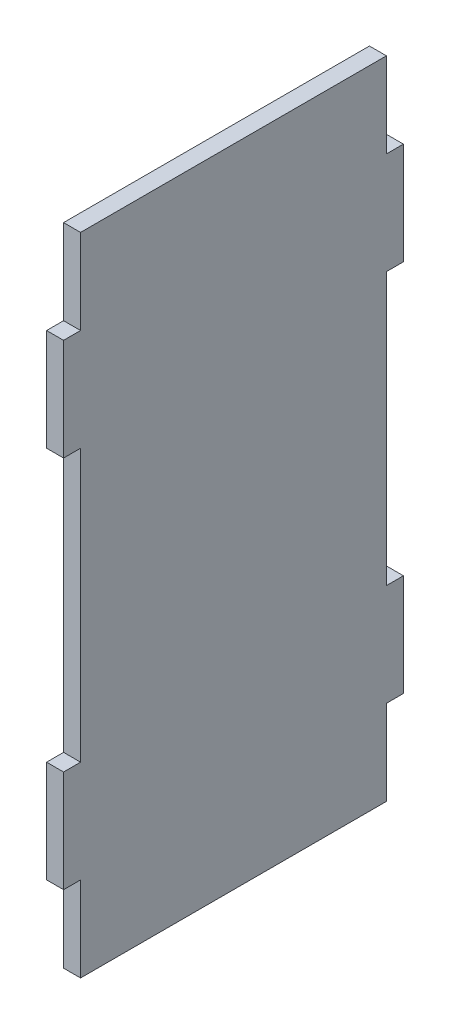
ISO-10303-21;
HEADER;
FILE_DESCRIPTION(('STEP AP214'),'2;1');
FILE_NAME('part.step','',(''),(''),'','','');
FILE_SCHEMA(('AUTOMOTIVE_DESIGN { 1 0 10303 214 1 1 1 1 }'));
ENDSEC;
DATA;
#1=APPLICATION_CONTEXT('core data for automotive mechanical design processes');
#2=APPLICATION_PROTOCOL_DEFINITION('international standard','automotive_design',2000,#1);
#3=PRODUCT_CONTEXT('',#1,'mechanical');
#4=PRODUCT('Part','Part','',(#3));
#5=PRODUCT_RELATED_PRODUCT_CATEGORY('part','',(#4));
#6=PRODUCT_DEFINITION_FORMATION('','',#4);
#7=PRODUCT_DEFINITION_CONTEXT('part definition',#1,'design');
#8=PRODUCT_DEFINITION('design','',#6,#7);
#9=PRODUCT_DEFINITION_SHAPE('','',#8);
#10=(LENGTH_UNIT() NAMED_UNIT(*) SI_UNIT(.MILLI.,.METRE.));
#11=(NAMED_UNIT(*) PLANE_ANGLE_UNIT() SI_UNIT($,.RADIAN.));
#12=(NAMED_UNIT(*) SI_UNIT($,.STERADIAN.) SOLID_ANGLE_UNIT());
#13=UNCERTAINTY_MEASURE_WITH_UNIT(LENGTH_MEASURE(1.E-05),#10,'distance_accuracy_value','');
#14=(GEOMETRIC_REPRESENTATION_CONTEXT(3) GLOBAL_UNCERTAINTY_ASSIGNED_CONTEXT((#13)) GLOBAL_UNIT_ASSIGNED_CONTEXT((#10,
#11,#12)) REPRESENTATION_CONTEXT('',''));
#15=CARTESIAN_POINT('',(0.,0.,0.));
#16=DIRECTION('',(0.,0.,1.));
#17=DIRECTION('',(1.,0.,0.));
#18=AXIS2_PLACEMENT_3D('',#15,#16,#17);
#19=CARTESIAN_POINT('',(3.175,0.,0.));
#20=DIRECTION('',(0.,0.,-1.));
#21=DIRECTION('',(-1.,0.,0.));
#22=AXIS2_PLACEMENT_3D('',#19,#20,#21);
#23=PLANE('',#22);
#24=DIRECTION('',(0.,-1.,0.));
#25=VECTOR('',#24,1.);
#26=CARTESIAN_POINT('',(0.,0.,0.));
#27=LINE('',#26,#25);
#28=CARTESIAN_POINT('',(0.,15.875,0.));
#29=VERTEX_POINT('',#28);
#30=CARTESIAN_POINT('',(0.,0.,0.));
#31=VERTEX_POINT('',#30);
#32=EDGE_CURVE('E201',#29,#31,#27,.T.);
#33=ORIENTED_EDGE('',*,*,#32,.T.);
#34=DIRECTION('',(-1.,0.,0.));
#35=VECTOR('',#34,1.);
#36=CARTESIAN_POINT('',(3.175,0.,0.));
#37=LINE('',#36,#35);
#38=CARTESIAN_POINT('',(3.175,0.,0.));
#39=VERTEX_POINT('',#38);
#40=EDGE_CURVE('E11',#39,#31,#37,.T.);
#41=ORIENTED_EDGE('',*,*,#40,.F.);
#42=DIRECTION('',(0.,-1.,0.));
#43=VECTOR('',#42,1.);
#44=CARTESIAN_POINT('',(3.175,0.,0.));
#45=LINE('',#44,#43);
#46=CARTESIAN_POINT('',(3.175,15.875,0.));
#47=VERTEX_POINT('',#46);
#48=EDGE_CURVE('E239',#47,#39,#45,.T.);
#49=ORIENTED_EDGE('',*,*,#48,.F.);
#50=DIRECTION('',(-1.,0.,0.));
#51=VECTOR('',#50,1.);
#52=CARTESIAN_POINT('',(3.175,15.875,0.));
#53=LINE('',#52,#51);
#54=EDGE_CURVE('E197',#47,#29,#53,.T.);
#55=ORIENTED_EDGE('',*,*,#54,.T.);
#56=EDGE_LOOP('',(#33,#41,#49,#55));
#57=FACE_BOUND('',#56,.T.);
#58=ADVANCED_FACE('F33',(#57),#23,.F.);
#59=CARTESIAN_POINT('',(3.175,0.,0.));
#60=DIRECTION('',(0.,1.,0.));
#61=DIRECTION('',(0.,0.,1.));
#62=AXIS2_PLACEMENT_3D('',#59,#60,#61);
#63=PLANE('',#62);
#64=DIRECTION('',(0.,0.,-1.));
#65=VECTOR('',#64,1.);
#66=CARTESIAN_POINT('',(0.,0.,0.));
#67=LINE('',#66,#65);
#68=CARTESIAN_POINT('',(0.,0.,-57.15));
#69=VERTEX_POINT('',#68);
#70=EDGE_CURVE('E204',#31,#69,#67,.T.);
#71=ORIENTED_EDGE('',*,*,#70,.T.);
#72=DIRECTION('',(-1.,0.,0.));
#73=VECTOR('',#72,1.);
#74=CARTESIAN_POINT('',(3.175,0.,-57.15));
#75=LINE('',#74,#73);
#76=CARTESIAN_POINT('',(3.175,0.,-57.15));
#77=VERTEX_POINT('',#76);
#78=EDGE_CURVE('E41',#77,#69,#75,.T.);
#79=ORIENTED_EDGE('',*,*,#78,.F.);
#80=DIRECTION('',(0.,0.,-1.));
#81=VECTOR('',#80,1.);
#82=CARTESIAN_POINT('',(3.175,0.,0.));
#83=LINE('',#82,#81);
#84=EDGE_CURVE('E128',#39,#77,#83,.T.);
#85=ORIENTED_EDGE('',*,*,#84,.F.);
#86=ORIENTED_EDGE('',*,*,#40,.T.);
#87=EDGE_LOOP('',(#71,#79,#85,#86));
#88=FACE_BOUND('',#87,.T.);
#89=ADVANCED_FACE('F357',(#88),#63,.F.);
#90=CARTESIAN_POINT('',(3.175,0.,-57.15));
#91=DIRECTION('',(0.,0.,1.));
#92=DIRECTION('',(1.,0.,0.));
#93=AXIS2_PLACEMENT_3D('',#90,#91,#92);
#94=PLANE('',#93);
#95=DIRECTION('',(0.,1.,0.));
#96=VECTOR('',#95,1.);
#97=CARTESIAN_POINT('',(0.,0.,-57.15));
#98=LINE('',#97,#96);
#99=CARTESIAN_POINT('',(0.,15.875,-57.15));
#100=VERTEX_POINT('',#99);
#101=EDGE_CURVE('E206',#69,#100,#98,.T.);
#102=ORIENTED_EDGE('',*,*,#101,.T.);
#103=DIRECTION('',(-1.,0.,0.));
#104=VECTOR('',#103,1.);
#105=CARTESIAN_POINT('',(3.175,15.875,-57.15));
#106=LINE('',#105,#104);
#107=CARTESIAN_POINT('',(3.175,15.875,-57.15));
#108=VERTEX_POINT('',#107);
#109=EDGE_CURVE('E282',#108,#100,#106,.T.);
#110=ORIENTED_EDGE('',*,*,#109,.F.);
#111=DIRECTION('',(0.,1.,0.));
#112=VECTOR('',#111,1.);
#113=CARTESIAN_POINT('',(3.175,0.,-57.15));
#114=LINE('',#113,#112);
#115=EDGE_CURVE('E290',#77,#108,#114,.T.);
#116=ORIENTED_EDGE('',*,*,#115,.F.);
#117=ORIENTED_EDGE('',*,*,#78,.T.);
#118=EDGE_LOOP('',(#102,#110,#116,#117));
#119=FACE_BOUND('',#118,.T.);
#120=ADVANCED_FACE('F288',(#119),#94,.F.);
#121=CARTESIAN_POINT('',(3.175,15.875,-57.15));
#122=DIRECTION('',(0.,1.,0.));
#123=DIRECTION('',(0.,0.,1.));
#124=AXIS2_PLACEMENT_3D('',#121,#122,#123);
#125=PLANE('',#124);
#126=DIRECTION('',(0.,0.,-1.));
#127=VECTOR('',#126,1.);
#128=CARTESIAN_POINT('',(0.,15.875,-57.15));
#129=LINE('',#128,#127);
#130=CARTESIAN_POINT('',(0.,15.875,-60.325));
#131=VERTEX_POINT('',#130);
#132=EDGE_CURVE('E208',#100,#131,#129,.T.);
#133=ORIENTED_EDGE('',*,*,#132,.T.);
#134=DIRECTION('',(-1.,0.,0.));
#135=VECTOR('',#134,1.);
#136=CARTESIAN_POINT('',(3.175,15.875,-60.325));
#137=LINE('',#136,#135);
#138=CARTESIAN_POINT('',(3.175,15.875,-60.325));
#139=VERTEX_POINT('',#138);
#140=EDGE_CURVE('E279',#139,#131,#137,.T.);
#141=ORIENTED_EDGE('',*,*,#140,.F.);
#142=DIRECTION('',(0.,0.,-1.));
#143=VECTOR('',#142,1.);
#144=CARTESIAN_POINT('',(3.175,15.875,-57.15));
#145=LINE('',#144,#143);
#146=EDGE_CURVE('E308',#108,#139,#145,.T.);
#147=ORIENTED_EDGE('',*,*,#146,.F.);
#148=ORIENTED_EDGE('',*,*,#109,.T.);
#149=EDGE_LOOP('',(#133,#141,#147,#148));
#150=FACE_BOUND('',#149,.T.);
#151=ADVANCED_FACE('F299',(#150),#125,.F.);
#152=CARTESIAN_POINT('',(3.175,15.875,-60.325));
#153=DIRECTION('',(0.,0.,1.));
#154=DIRECTION('',(0.,-1.,0.));
#155=AXIS2_PLACEMENT_3D('',#152,#153,#154);
#156=PLANE('',#155);
#157=DIRECTION('',(0.,1.,0.));
#158=VECTOR('',#157,1.);
#159=CARTESIAN_POINT('',(0.,15.875,-60.325));
#160=LINE('',#159,#158);
#161=CARTESIAN_POINT('',(0.,34.925,-60.325));
#162=VERTEX_POINT('',#161);
#163=EDGE_CURVE('E210',#131,#162,#160,.T.);
#164=ORIENTED_EDGE('',*,*,#163,.T.);
#165=DIRECTION('',(-1.,0.,0.));
#166=VECTOR('',#165,1.);
#167=CARTESIAN_POINT('',(3.175,34.925,-60.325));
#168=LINE('',#167,#166);
#169=CARTESIAN_POINT('',(3.175,34.925,-60.325));
#170=VERTEX_POINT('',#169);
#171=EDGE_CURVE('E276',#170,#162,#168,.T.);
#172=ORIENTED_EDGE('',*,*,#171,.F.);
#173=DIRECTION('',(0.,1.,0.));
#174=VECTOR('',#173,1.);
#175=CARTESIAN_POINT('',(3.175,15.875,-60.325));
#176=LINE('',#175,#174);
#177=EDGE_CURVE('E305',#139,#170,#176,.T.);
#178=ORIENTED_EDGE('',*,*,#177,.F.);
#179=ORIENTED_EDGE('',*,*,#140,.T.);
#180=EDGE_LOOP('',(#164,#172,#178,#179));
#181=FACE_BOUND('',#180,.T.);
#182=ADVANCED_FACE('F303',(#181),#156,.F.);
#183=CARTESIAN_POINT('',(3.175,34.925,-60.325));
#184=DIRECTION('',(0.,-1.,0.));
#185=DIRECTION('',(0.,0.,-1.));
#186=AXIS2_PLACEMENT_3D('',#183,#184,#185);
#187=PLANE('',#186);
#188=DIRECTION('',(0.,0.,1.));
#189=VECTOR('',#188,1.);
#190=CARTESIAN_POINT('',(0.,34.925,-60.325));
#191=LINE('',#190,#189);
#192=CARTESIAN_POINT('',(0.,34.925,-57.15));
#193=VERTEX_POINT('',#192);
#194=EDGE_CURVE('E212',#162,#193,#191,.T.);
#195=ORIENTED_EDGE('',*,*,#194,.T.);
#196=DIRECTION('',(-1.,0.,0.));
#197=VECTOR('',#196,1.);
#198=CARTESIAN_POINT('',(3.175,34.925,-57.15));
#199=LINE('',#198,#197);
#200=CARTESIAN_POINT('',(3.175,34.925,-57.15));
#201=VERTEX_POINT('',#200);
#202=EDGE_CURVE('E273',#201,#193,#199,.T.);
#203=ORIENTED_EDGE('',*,*,#202,.F.);
#204=DIRECTION('',(0.,0.,1.));
#205=VECTOR('',#204,1.);
#206=CARTESIAN_POINT('',(3.175,34.925,-60.325));
#207=LINE('',#206,#205);
#208=EDGE_CURVE('E307',#170,#201,#207,.T.);
#209=ORIENTED_EDGE('',*,*,#208,.F.);
#210=ORIENTED_EDGE('',*,*,#171,.T.);
#211=EDGE_LOOP('',(#195,#203,#209,#210));
#212=FACE_BOUND('',#211,.T.);
#213=ADVANCED_FACE('F370',(#212),#187,.F.);
#214=CARTESIAN_POINT('',(3.175,34.925,-57.15));
#215=DIRECTION('',(0.,0.,1.));
#216=DIRECTION('',(1.,0.,0.));
#217=AXIS2_PLACEMENT_3D('',#214,#215,#216);
#218=PLANE('',#217);
#219=DIRECTION('',(0.,1.,0.));
#220=VECTOR('',#219,1.);
#221=CARTESIAN_POINT('',(0.,34.925,-57.15));
#222=LINE('',#221,#220);
#223=CARTESIAN_POINT('',(0.,85.725,-57.15));
#224=VERTEX_POINT('',#223);
#225=EDGE_CURVE('E214',#193,#224,#222,.T.);
#226=ORIENTED_EDGE('',*,*,#225,.T.);
#227=DIRECTION('',(-1.,0.,0.));
#228=VECTOR('',#227,1.);
#229=CARTESIAN_POINT('',(3.175,85.725,-57.15));
#230=LINE('',#229,#228);
#231=CARTESIAN_POINT('',(3.175,85.725,-57.15));
#232=VERTEX_POINT('',#231);
#233=EDGE_CURVE('E270',#232,#224,#230,.T.);
#234=ORIENTED_EDGE('',*,*,#233,.F.);
#235=DIRECTION('',(0.,1.,0.));
#236=VECTOR('',#235,1.);
#237=CARTESIAN_POINT('',(3.175,34.925,-57.15));
#238=LINE('',#237,#236);
#239=EDGE_CURVE('E310',#201,#232,#238,.T.);
#240=ORIENTED_EDGE('',*,*,#239,.F.);
#241=ORIENTED_EDGE('',*,*,#202,.T.);
#242=EDGE_LOOP('',(#226,#234,#240,#241));
#243=FACE_BOUND('',#242,.T.);
#244=ADVANCED_FACE('F373',(#243),#218,.F.);
#245=CARTESIAN_POINT('',(3.175,85.725,-60.325));
#246=DIRECTION('',(0.,1.,0.));
#247=DIRECTION('',(0.,0.,1.));
#248=AXIS2_PLACEMENT_3D('',#245,#246,#247);
#249=PLANE('',#248);
#250=DIRECTION('',(0.,0.,-1.));
#251=VECTOR('',#250,1.);
#252=CARTESIAN_POINT('',(0.,85.725,-60.325));
#253=LINE('',#252,#251);
#254=CARTESIAN_POINT('',(0.,85.725,-60.325));
#255=VERTEX_POINT('',#254);
#256=EDGE_CURVE('E216',#224,#255,#253,.T.);
#257=ORIENTED_EDGE('',*,*,#256,.T.);
#258=DIRECTION('',(-1.,0.,0.));
#259=VECTOR('',#258,1.);
#260=CARTESIAN_POINT('',(3.175,85.725,-60.325));
#261=LINE('',#260,#259);
#262=CARTESIAN_POINT('',(3.175,85.725,-60.325));
#263=VERTEX_POINT('',#262);
#264=EDGE_CURVE('E267',#263,#255,#261,.T.);
#265=ORIENTED_EDGE('',*,*,#264,.F.);
#266=DIRECTION('',(0.,0.,-1.));
#267=VECTOR('',#266,1.);
#268=CARTESIAN_POINT('',(3.175,85.725,-60.325));
#269=LINE('',#268,#267);
#270=EDGE_CURVE('E316',#232,#263,#269,.T.);
#271=ORIENTED_EDGE('',*,*,#270,.F.);
#272=ORIENTED_EDGE('',*,*,#233,.T.);
#273=EDGE_LOOP('',(#257,#265,#271,#272));
#274=FACE_BOUND('',#273,.T.);
#275=ADVANCED_FACE('F377',(#274),#249,.F.);
#276=CARTESIAN_POINT('',(3.175,104.775,-60.325));
#277=DIRECTION('',(0.,0.,1.));
#278=DIRECTION('',(1.,0.,0.));
#279=AXIS2_PLACEMENT_3D('',#276,#277,#278);
#280=PLANE('',#279);
#281=DIRECTION('',(0.,1.,0.));
#282=VECTOR('',#281,1.);
#283=CARTESIAN_POINT('',(0.,104.775,-60.325));
#284=LINE('',#283,#282);
#285=CARTESIAN_POINT('',(0.,104.775,-60.325));
#286=VERTEX_POINT('',#285);
#287=EDGE_CURVE('E218',#255,#286,#284,.T.);
#288=ORIENTED_EDGE('',*,*,#287,.T.);
#289=DIRECTION('',(-1.,0.,0.));
#290=VECTOR('',#289,1.);
#291=CARTESIAN_POINT('',(3.175,104.775,-60.325));
#292=LINE('',#291,#290);
#293=CARTESIAN_POINT('',(3.175,104.775,-60.325));
#294=VERTEX_POINT('',#293);
#295=EDGE_CURVE('E264',#294,#286,#292,.T.);
#296=ORIENTED_EDGE('',*,*,#295,.F.);
#297=DIRECTION('',(0.,1.,0.));
#298=VECTOR('',#297,1.);
#299=CARTESIAN_POINT('',(3.175,104.775,-60.325));
#300=LINE('',#299,#298);
#301=EDGE_CURVE('E318',#263,#294,#300,.T.);
#302=ORIENTED_EDGE('',*,*,#301,.F.);
#303=ORIENTED_EDGE('',*,*,#264,.T.);
#304=EDGE_LOOP('',(#288,#296,#302,#303));
#305=FACE_BOUND('',#304,.T.);
#306=ADVANCED_FACE('F381',(#305),#280,.F.);
#307=CARTESIAN_POINT('',(3.175,104.775,-57.15));
#308=DIRECTION('',(0.,-1.,0.));
#309=DIRECTION('',(0.,0.,-1.));
#310=AXIS2_PLACEMENT_3D('',#307,#308,#309);
#311=PLANE('',#310);
#312=DIRECTION('',(0.,0.,1.));
#313=VECTOR('',#312,1.);
#314=CARTESIAN_POINT('',(0.,104.775,-57.15));
#315=LINE('',#314,#313);
#316=CARTESIAN_POINT('',(0.,104.775,-57.15));
#317=VERTEX_POINT('',#316);
#318=EDGE_CURVE('E220',#286,#317,#315,.T.);
#319=ORIENTED_EDGE('',*,*,#318,.T.);
#320=DIRECTION('',(-1.,0.,0.));
#321=VECTOR('',#320,1.);
#322=CARTESIAN_POINT('',(3.175,104.775,-57.15));
#323=LINE('',#322,#321);
#324=CARTESIAN_POINT('',(3.175,104.775,-57.15));
#325=VERTEX_POINT('',#324);
#326=EDGE_CURVE('E261',#325,#317,#323,.T.);
#327=ORIENTED_EDGE('',*,*,#326,.F.);
#328=DIRECTION('',(0.,0.,1.));
#329=VECTOR('',#328,1.);
#330=CARTESIAN_POINT('',(3.175,104.775,-57.15));
#331=LINE('',#330,#329);
#332=EDGE_CURVE('E320',#294,#325,#331,.T.);
#333=ORIENTED_EDGE('',*,*,#332,.F.);
#334=ORIENTED_EDGE('',*,*,#295,.T.);
#335=EDGE_LOOP('',(#319,#327,#333,#334));
#336=FACE_BOUND('',#335,.T.);
#337=ADVANCED_FACE('F385',(#336),#311,.F.);
#338=CARTESIAN_POINT('',(3.175,104.775,-57.15));
#339=DIRECTION('',(0.,0.,1.));
#340=DIRECTION('',(1.,0.,0.));
#341=AXIS2_PLACEMENT_3D('',#338,#339,#340);
#342=PLANE('',#341);
#343=DIRECTION('',(0.,1.,0.));
#344=VECTOR('',#343,1.);
#345=CARTESIAN_POINT('',(0.,104.775,-57.15));
#346=LINE('',#345,#344);
#347=CARTESIAN_POINT('',(0.,120.65,-57.15));
#348=VERTEX_POINT('',#347);
#349=EDGE_CURVE('E222',#317,#348,#346,.T.);
#350=ORIENTED_EDGE('',*,*,#349,.T.);
#351=DIRECTION('',(-1.,0.,0.));
#352=VECTOR('',#351,1.);
#353=CARTESIAN_POINT('',(3.175,120.65,-57.15));
#354=LINE('',#353,#352);
#355=CARTESIAN_POINT('',(3.175,120.65,-57.15));
#356=VERTEX_POINT('',#355);
#357=EDGE_CURVE('E258',#356,#348,#354,.T.);
#358=ORIENTED_EDGE('',*,*,#357,.F.);
#359=DIRECTION('',(0.,1.,0.));
#360=VECTOR('',#359,1.);
#361=CARTESIAN_POINT('',(3.175,104.775,-57.15));
#362=LINE('',#361,#360);
#363=EDGE_CURVE('E322',#325,#356,#362,.T.);
#364=ORIENTED_EDGE('',*,*,#363,.F.);
#365=ORIENTED_EDGE('',*,*,#326,.T.);
#366=EDGE_LOOP('',(#350,#358,#364,#365));
#367=FACE_BOUND('',#366,.T.);
#368=ADVANCED_FACE('F389',(#367),#342,.F.);
#369=CARTESIAN_POINT('',(3.175,120.65,0.));
#370=DIRECTION('',(0.,-1.,0.));
#371=DIRECTION('',(0.,0.,-1.));
#372=AXIS2_PLACEMENT_3D('',#369,#370,#371);
#373=PLANE('',#372);
#374=DIRECTION('',(0.,0.,1.));
#375=VECTOR('',#374,1.);
#376=CARTESIAN_POINT('',(0.,120.65,0.));
#377=LINE('',#376,#375);
#378=CARTESIAN_POINT('',(0.,120.65,0.));
#379=VERTEX_POINT('',#378);
#380=EDGE_CURVE('E224',#348,#379,#377,.T.);
#381=ORIENTED_EDGE('',*,*,#380,.T.);
#382=DIRECTION('',(-1.,0.,0.));
#383=VECTOR('',#382,1.);
#384=CARTESIAN_POINT('',(3.175,120.65,0.));
#385=LINE('',#384,#383);
#386=CARTESIAN_POINT('',(3.175,120.65,0.));
#387=VERTEX_POINT('',#386);
#388=EDGE_CURVE('E255',#387,#379,#385,.T.);
#389=ORIENTED_EDGE('',*,*,#388,.F.);
#390=DIRECTION('',(0.,0.,1.));
#391=VECTOR('',#390,1.);
#392=CARTESIAN_POINT('',(3.175,120.65,0.));
#393=LINE('',#392,#391);
#394=EDGE_CURVE('E324',#356,#387,#393,.T.);
#395=ORIENTED_EDGE('',*,*,#394,.F.);
#396=ORIENTED_EDGE('',*,*,#357,.T.);
#397=EDGE_LOOP('',(#381,#389,#395,#396));
#398=FACE_BOUND('',#397,.T.);
#399=ADVANCED_FACE('F393',(#398),#373,.F.);
#400=CARTESIAN_POINT('',(3.175,104.775,0.));
#401=DIRECTION('',(0.,0.,-1.));
#402=DIRECTION('',(-1.,0.,0.));
#403=AXIS2_PLACEMENT_3D('',#400,#401,#402);
#404=PLANE('',#403);
#405=DIRECTION('',(0.,-1.,0.));
#406=VECTOR('',#405,1.);
#407=CARTESIAN_POINT('',(0.,104.775,0.));
#408=LINE('',#407,#406);
#409=CARTESIAN_POINT('',(0.,104.775,0.));
#410=VERTEX_POINT('',#409);
#411=EDGE_CURVE('E226',#379,#410,#408,.T.);
#412=ORIENTED_EDGE('',*,*,#411,.T.);
#413=DIRECTION('',(-1.,0.,0.));
#414=VECTOR('',#413,1.);
#415=CARTESIAN_POINT('',(3.175,104.775,0.));
#416=LINE('',#415,#414);
#417=CARTESIAN_POINT('',(3.175,104.775,0.));
#418=VERTEX_POINT('',#417);
#419=EDGE_CURVE('E252',#418,#410,#416,.T.);
#420=ORIENTED_EDGE('',*,*,#419,.F.);
#421=DIRECTION('',(0.,-1.,0.));
#422=VECTOR('',#421,1.);
#423=CARTESIAN_POINT('',(3.175,104.775,0.));
#424=LINE('',#423,#422);
#425=EDGE_CURVE('E326',#387,#418,#424,.T.);
#426=ORIENTED_EDGE('',*,*,#425,.F.);
#427=ORIENTED_EDGE('',*,*,#388,.T.);
#428=EDGE_LOOP('',(#412,#420,#426,#427));
#429=FACE_BOUND('',#428,.T.);
#430=ADVANCED_FACE('F397',(#429),#404,.F.);
#431=CARTESIAN_POINT('',(3.175,104.775,0.));
#432=DIRECTION('',(0.,-1.,0.));
#433=DIRECTION('',(0.,0.,-1.));
#434=AXIS2_PLACEMENT_3D('',#431,#432,#433);
#435=PLANE('',#434);
#436=DIRECTION('',(0.,0.,1.));
#437=VECTOR('',#436,1.);
#438=CARTESIAN_POINT('',(0.,104.775,0.));
#439=LINE('',#438,#437);
#440=CARTESIAN_POINT('',(0.,104.775,3.175));
#441=VERTEX_POINT('',#440);
#442=EDGE_CURVE('E228',#410,#441,#439,.T.);
#443=ORIENTED_EDGE('',*,*,#442,.T.);
#444=DIRECTION('',(-1.,0.,0.));
#445=VECTOR('',#444,1.);
#446=CARTESIAN_POINT('',(3.175,104.775,3.175));
#447=LINE('',#446,#445);
#448=CARTESIAN_POINT('',(3.175,104.775,3.175));
#449=VERTEX_POINT('',#448);
#450=EDGE_CURVE('E249',#449,#441,#447,.T.);
#451=ORIENTED_EDGE('',*,*,#450,.F.);
#452=DIRECTION('',(0.,0.,1.));
#453=VECTOR('',#452,1.);
#454=CARTESIAN_POINT('',(3.175,104.775,0.));
#455=LINE('',#454,#453);
#456=EDGE_CURVE('E328',#418,#449,#455,.T.);
#457=ORIENTED_EDGE('',*,*,#456,.F.);
#458=ORIENTED_EDGE('',*,*,#419,.T.);
#459=EDGE_LOOP('',(#443,#451,#457,#458));
#460=FACE_BOUND('',#459,.T.);
#461=ADVANCED_FACE('F401',(#460),#435,.F.);
#462=CARTESIAN_POINT('',(3.175,104.775,3.175));
#463=DIRECTION('',(0.,0.,-1.));
#464=DIRECTION('',(0.,1.,0.));
#465=AXIS2_PLACEMENT_3D('',#462,#463,#464);
#466=PLANE('',#465);
#467=DIRECTION('',(0.,-1.,0.));
#468=VECTOR('',#467,1.);
#469=CARTESIAN_POINT('',(0.,104.775,3.175));
#470=LINE('',#469,#468);
#471=CARTESIAN_POINT('',(0.,85.725,3.175));
#472=VERTEX_POINT('',#471);
#473=EDGE_CURVE('E230',#441,#472,#470,.T.);
#474=ORIENTED_EDGE('',*,*,#473,.T.);
#475=DIRECTION('',(-1.,0.,0.));
#476=VECTOR('',#475,1.);
#477=CARTESIAN_POINT('',(3.175,85.725,3.175));
#478=LINE('',#477,#476);
#479=CARTESIAN_POINT('',(3.175,85.725,3.175));
#480=VERTEX_POINT('',#479);
#481=EDGE_CURVE('E246',#480,#472,#478,.T.);
#482=ORIENTED_EDGE('',*,*,#481,.F.);
#483=DIRECTION('',(0.,-1.,0.));
#484=VECTOR('',#483,1.);
#485=CARTESIAN_POINT('',(3.175,104.775,3.175));
#486=LINE('',#485,#484);
#487=EDGE_CURVE('E330',#449,#480,#486,.T.);
#488=ORIENTED_EDGE('',*,*,#487,.F.);
#489=ORIENTED_EDGE('',*,*,#450,.T.);
#490=EDGE_LOOP('',(#474,#482,#488,#489));
#491=FACE_BOUND('',#490,.T.);
#492=ADVANCED_FACE('F405',(#491),#466,.F.);
#493=CARTESIAN_POINT('',(3.175,85.725,3.175));
#494=DIRECTION('',(0.,1.,0.));
#495=DIRECTION('',(0.,0.,1.));
#496=AXIS2_PLACEMENT_3D('',#493,#494,#495);
#497=PLANE('',#496);
#498=DIRECTION('',(0.,0.,-1.));
#499=VECTOR('',#498,1.);
#500=CARTESIAN_POINT('',(0.,85.725,3.175));
#501=LINE('',#500,#499);
#502=CARTESIAN_POINT('',(0.,85.725,0.));
#503=VERTEX_POINT('',#502);
#504=EDGE_CURVE('E232',#472,#503,#501,.T.);
#505=ORIENTED_EDGE('',*,*,#504,.T.);
#506=DIRECTION('',(-1.,0.,0.));
#507=VECTOR('',#506,1.);
#508=CARTESIAN_POINT('',(3.175,85.725,0.));
#509=LINE('',#508,#507);
#510=CARTESIAN_POINT('',(3.175,85.725,0.));
#511=VERTEX_POINT('',#510);
#512=EDGE_CURVE('E243',#511,#503,#509,.T.);
#513=ORIENTED_EDGE('',*,*,#512,.F.);
#514=DIRECTION('',(0.,0.,-1.));
#515=VECTOR('',#514,1.);
#516=CARTESIAN_POINT('',(3.175,85.725,3.175));
#517=LINE('',#516,#515);
#518=EDGE_CURVE('E332',#480,#511,#517,.T.);
#519=ORIENTED_EDGE('',*,*,#518,.F.);
#520=ORIENTED_EDGE('',*,*,#481,.T.);
#521=EDGE_LOOP('',(#505,#513,#519,#520));
#522=FACE_BOUND('',#521,.T.);
#523=ADVANCED_FACE('F338',(#522),#497,.F.);
#524=CARTESIAN_POINT('',(3.175,34.925,0.));
#525=DIRECTION('',(0.,0.,-1.));
#526=DIRECTION('',(-1.,0.,0.));
#527=AXIS2_PLACEMENT_3D('',#524,#525,#526);
#528=PLANE('',#527);
#529=DIRECTION('',(0.,-1.,0.));
#530=VECTOR('',#529,1.);
#531=CARTESIAN_POINT('',(0.,34.925,0.));
#532=LINE('',#531,#530);
#533=CARTESIAN_POINT('',(0.,34.925,0.));
#534=VERTEX_POINT('',#533);
#535=EDGE_CURVE('E234',#503,#534,#532,.T.);
#536=ORIENTED_EDGE('',*,*,#535,.T.);
#537=DIRECTION('',(-1.,0.,0.));
#538=VECTOR('',#537,1.);
#539=CARTESIAN_POINT('',(3.175,34.925,0.));
#540=LINE('',#539,#538);
#541=CARTESIAN_POINT('',(3.175,34.925,0.));
#542=VERTEX_POINT('',#541);
#543=EDGE_CURVE('E192',#542,#534,#540,.T.);
#544=ORIENTED_EDGE('',*,*,#543,.F.);
#545=DIRECTION('',(0.,-1.,0.));
#546=VECTOR('',#545,1.);
#547=CARTESIAN_POINT('',(3.175,34.925,0.));
#548=LINE('',#547,#546);
#549=EDGE_CURVE('E183',#511,#542,#548,.T.);
#550=ORIENTED_EDGE('',*,*,#549,.F.);
#551=ORIENTED_EDGE('',*,*,#512,.T.);
#552=EDGE_LOOP('',(#536,#544,#550,#551));
#553=FACE_BOUND('',#552,.T.);
#554=ADVANCED_FACE('F342',(#553),#528,.F.);
#555=CARTESIAN_POINT('',(3.175,34.925,3.175));
#556=DIRECTION('',(0.,-1.,0.));
#557=DIRECTION('',(0.,0.,-1.));
#558=AXIS2_PLACEMENT_3D('',#555,#556,#557);
#559=PLANE('',#558);
#560=DIRECTION('',(0.,0.,1.));
#561=VECTOR('',#560,1.);
#562=CARTESIAN_POINT('',(0.,34.925,3.175));
#563=LINE('',#562,#561);
#564=CARTESIAN_POINT('',(0.,34.925,3.175));
#565=VERTEX_POINT('',#564);
#566=EDGE_CURVE('E191',#534,#565,#563,.T.);
#567=ORIENTED_EDGE('',*,*,#566,.T.);
#568=DIRECTION('',(-1.,0.,0.));
#569=VECTOR('',#568,1.);
#570=CARTESIAN_POINT('',(3.175,34.925,3.175));
#571=LINE('',#570,#569);
#572=CARTESIAN_POINT('',(3.175,34.925,3.175));
#573=VERTEX_POINT('',#572);
#574=EDGE_CURVE('E188',#573,#565,#571,.T.);
#575=ORIENTED_EDGE('',*,*,#574,.F.);
#576=DIRECTION('',(0.,0.,1.));
#577=VECTOR('',#576,1.);
#578=CARTESIAN_POINT('',(3.175,34.925,3.175));
#579=LINE('',#578,#577);
#580=EDGE_CURVE('E177',#542,#573,#579,.T.);
#581=ORIENTED_EDGE('',*,*,#580,.F.);
#582=ORIENTED_EDGE('',*,*,#543,.T.);
#583=EDGE_LOOP('',(#567,#575,#581,#582));
#584=FACE_BOUND('',#583,.T.);
#585=ADVANCED_FACE('F189',(#584),#559,.F.);
#586=CARTESIAN_POINT('',(3.175,15.875,3.175));
#587=DIRECTION('',(0.,0.,-1.));
#588=DIRECTION('',(0.,1.,0.));
#589=AXIS2_PLACEMENT_3D('',#586,#587,#588);
#590=PLANE('',#589);
#591=DIRECTION('',(0.,-1.,0.));
#592=VECTOR('',#591,1.);
#593=CARTESIAN_POINT('',(0.,15.875,3.175));
#594=LINE('',#593,#592);
#595=CARTESIAN_POINT('',(0.,15.875,3.175));
#596=VERTEX_POINT('',#595);
#597=EDGE_CURVE('E114',#565,#596,#594,.T.);
#598=ORIENTED_EDGE('',*,*,#597,.T.);
#599=DIRECTION('',(-1.,0.,0.));
#600=VECTOR('',#599,1.);
#601=CARTESIAN_POINT('',(3.175,15.875,3.175));
#602=LINE('',#601,#600);
#603=CARTESIAN_POINT('',(3.175,15.875,3.175));
#604=VERTEX_POINT('',#603);
#605=EDGE_CURVE('E193',#604,#596,#602,.T.);
#606=ORIENTED_EDGE('',*,*,#605,.F.);
#607=DIRECTION('',(0.,-1.,0.));
#608=VECTOR('',#607,1.);
#609=CARTESIAN_POINT('',(3.175,15.875,3.175));
#610=LINE('',#609,#608);
#611=EDGE_CURVE('E181',#573,#604,#610,.T.);
#612=ORIENTED_EDGE('',*,*,#611,.F.);
#613=ORIENTED_EDGE('',*,*,#574,.T.);
#614=EDGE_LOOP('',(#598,#606,#612,#613));
#615=FACE_BOUND('',#614,.T.);
#616=ADVANCED_FACE('F195',(#615),#590,.F.);
#617=CARTESIAN_POINT('',(3.175,15.875,0.));
#618=DIRECTION('',(0.,1.,0.));
#619=DIRECTION('',(0.,0.,1.));
#620=AXIS2_PLACEMENT_3D('',#617,#618,#619);
#621=PLANE('',#620);
#622=DIRECTION('',(0.,0.,-1.));
#623=VECTOR('',#622,1.);
#624=CARTESIAN_POINT('',(0.,15.875,0.));
#625=LINE('',#624,#623);
#626=EDGE_CURVE('E120',#596,#29,#625,.T.);
#627=ORIENTED_EDGE('',*,*,#626,.T.);
#628=ORIENTED_EDGE('',*,*,#54,.F.);
#629=DIRECTION('',(0.,0.,-1.));
#630=VECTOR('',#629,1.);
#631=CARTESIAN_POINT('',(3.175,15.875,0.));
#632=LINE('',#631,#630);
#633=EDGE_CURVE('E49',#604,#47,#632,.T.);
#634=ORIENTED_EDGE('',*,*,#633,.F.);
#635=ORIENTED_EDGE('',*,*,#605,.T.);
#636=EDGE_LOOP('',(#627,#628,#634,#635));
#637=FACE_BOUND('',#636,.T.);
#638=ADVANCED_FACE('F346',(#637),#621,.F.);
#639=CARTESIAN_POINT('',(3.175,0.,0.));
#640=DIRECTION('',(1.,0.,0.));
#641=DIRECTION('',(0.,0.,-1.));
#642=AXIS2_PLACEMENT_3D('',#639,#640,#641);
#643=PLANE('',#642);
#644=ORIENTED_EDGE('',*,*,#48,.T.);
#645=ORIENTED_EDGE('',*,*,#84,.T.);
#646=ORIENTED_EDGE('',*,*,#115,.T.);
#647=ORIENTED_EDGE('',*,*,#146,.T.);
#648=ORIENTED_EDGE('',*,*,#177,.T.);
#649=ORIENTED_EDGE('',*,*,#208,.T.);
#650=ORIENTED_EDGE('',*,*,#239,.T.);
#651=ORIENTED_EDGE('',*,*,#270,.T.);
#652=ORIENTED_EDGE('',*,*,#301,.T.);
#653=ORIENTED_EDGE('',*,*,#332,.T.);
#654=ORIENTED_EDGE('',*,*,#363,.T.);
#655=ORIENTED_EDGE('',*,*,#394,.T.);
#656=ORIENTED_EDGE('',*,*,#425,.T.);
#657=ORIENTED_EDGE('',*,*,#456,.T.);
#658=ORIENTED_EDGE('',*,*,#487,.T.);
#659=ORIENTED_EDGE('',*,*,#518,.T.);
#660=ORIENTED_EDGE('',*,*,#549,.T.);
#661=ORIENTED_EDGE('',*,*,#580,.T.);
#662=ORIENTED_EDGE('',*,*,#611,.T.);
#663=ORIENTED_EDGE('',*,*,#633,.T.);
#664=EDGE_LOOP('',(#644,#645,#646,#647,#648,#649,#650,#651,#652,#653,#654,#655,#656,#657,#658,
#659,#660,#661,#662,#663));
#665=FACE_BOUND('',#664,.T.);
#666=ADVANCED_FACE('F179',(#665),#643,.T.);
#667=CARTESIAN_POINT('',(0.,0.,0.));
#668=DIRECTION('',(1.,0.,0.));
#669=DIRECTION('',(0.,0.,-1.));
#670=AXIS2_PLACEMENT_3D('',#667,#668,#669);
#671=PLANE('',#670);
#672=ORIENTED_EDGE('',*,*,#32,.F.);
#673=ORIENTED_EDGE('',*,*,#626,.F.);
#674=ORIENTED_EDGE('',*,*,#597,.F.);
#675=ORIENTED_EDGE('',*,*,#566,.F.);
#676=ORIENTED_EDGE('',*,*,#535,.F.);
#677=ORIENTED_EDGE('',*,*,#504,.F.);
#678=ORIENTED_EDGE('',*,*,#473,.F.);
#679=ORIENTED_EDGE('',*,*,#442,.F.);
#680=ORIENTED_EDGE('',*,*,#411,.F.);
#681=ORIENTED_EDGE('',*,*,#380,.F.);
#682=ORIENTED_EDGE('',*,*,#349,.F.);
#683=ORIENTED_EDGE('',*,*,#318,.F.);
#684=ORIENTED_EDGE('',*,*,#287,.F.);
#685=ORIENTED_EDGE('',*,*,#256,.F.);
#686=ORIENTED_EDGE('',*,*,#225,.F.);
#687=ORIENTED_EDGE('',*,*,#194,.F.);
#688=ORIENTED_EDGE('',*,*,#163,.F.);
#689=ORIENTED_EDGE('',*,*,#132,.F.);
#690=ORIENTED_EDGE('',*,*,#101,.F.);
#691=ORIENTED_EDGE('',*,*,#70,.F.);
#692=EDGE_LOOP('',(#672,#673,#674,#675,#676,#677,#678,#679,#680,#681,#682,#683,#684,#685,#686,
#687,#688,#689,#690,#691));
#693=FACE_BOUND('',#692,.T.);
#694=ADVANCED_FACE('F294',(#693),#671,.F.);
#695=CLOSED_SHELL('',(#58,#89,#120,#151,#182,#213,#244,#275,#306,#337,#368,#399,#430,#461,#492,
#523,#554,#585,#616,#638,#666,#694));
#696=MANIFOLD_SOLID_BREP('B2',#695);
#697=ADVANCED_BREP_SHAPE_REPRESENTATION('',(#18,#696),#14);
#698=SHAPE_DEFINITION_REPRESENTATION(#9,#697);
ENDSEC;
END-ISO-10303-21;
